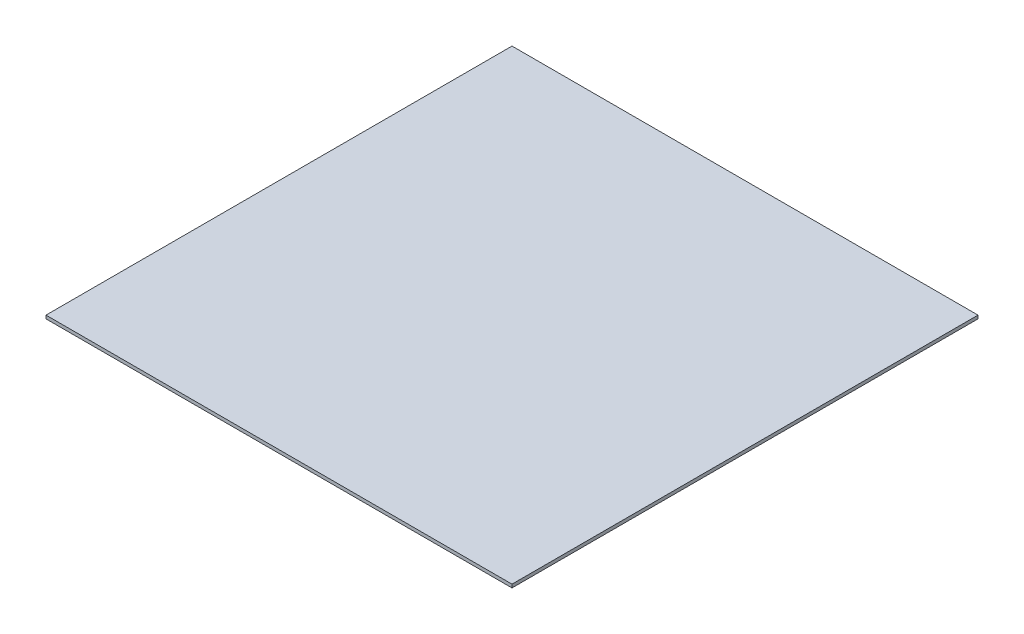
ISO-10303-21;
HEADER;
FILE_DESCRIPTION(('STEP AP214'),'2;1');
FILE_NAME('part.step','',(''),(''),'','','');
FILE_SCHEMA(('AUTOMOTIVE_DESIGN { 1 0 10303 214 1 1 1 1 }'));
ENDSEC;
DATA;
#1=APPLICATION_CONTEXT('core data for automotive mechanical design processes');
#2=APPLICATION_PROTOCOL_DEFINITION('international standard','automotive_design',2000,#1);
#3=PRODUCT_CONTEXT('',#1,'mechanical');
#4=PRODUCT('Part','Part','',(#3));
#5=PRODUCT_RELATED_PRODUCT_CATEGORY('part','',(#4));
#6=PRODUCT_DEFINITION_FORMATION('','',#4);
#7=PRODUCT_DEFINITION_CONTEXT('part definition',#1,'design');
#8=PRODUCT_DEFINITION('design','',#6,#7);
#9=PRODUCT_DEFINITION_SHAPE('','',#8);
#10=(LENGTH_UNIT() NAMED_UNIT(*) SI_UNIT(.MILLI.,.METRE.));
#11=(NAMED_UNIT(*) PLANE_ANGLE_UNIT() SI_UNIT($,.RADIAN.));
#12=(NAMED_UNIT(*) SI_UNIT($,.STERADIAN.) SOLID_ANGLE_UNIT());
#13=UNCERTAINTY_MEASURE_WITH_UNIT(LENGTH_MEASURE(1.E-05),#10,'distance_accuracy_value','');
#14=(GEOMETRIC_REPRESENTATION_CONTEXT(3) GLOBAL_UNCERTAINTY_ASSIGNED_CONTEXT((#13)) GLOBAL_UNIT_ASSIGNED_CONTEXT((#10,
#11,#12)) REPRESENTATION_CONTEXT('',''));
#15=CARTESIAN_POINT('',(0.,0.,0.));
#16=DIRECTION('',(0.,0.,1.));
#17=DIRECTION('',(1.,0.,0.));
#18=AXIS2_PLACEMENT_3D('',#15,#16,#17);
#19=CARTESIAN_POINT('',(0.,3.175,0.));
#20=DIRECTION('',(1.,0.,0.));
#21=DIRECTION('',(0.,0.,-1.));
#22=AXIS2_PLACEMENT_3D('',#19,#20,#21);
#23=PLANE('',#22);
#24=DIRECTION('',(0.,0.,1.));
#25=VECTOR('',#24,1.);
#26=CARTESIAN_POINT('',(0.,0.,0.));
#27=LINE('',#26,#25);
#28=CARTESIAN_POINT('',(0.,0.,-450.));
#29=VERTEX_POINT('',#28);
#30=CARTESIAN_POINT('',(0.,0.,0.));
#31=VERTEX_POINT('',#30);
#32=EDGE_CURVE('E111',#29,#31,#27,.T.);
#33=ORIENTED_EDGE('',*,*,#32,.T.);
#34=DIRECTION('',(0.,-1.,0.));
#35=VECTOR('',#34,1.);
#36=CARTESIAN_POINT('',(0.,3.175,0.));
#37=LINE('',#36,#35);
#38=CARTESIAN_POINT('',(0.,3.175,0.));
#39=VERTEX_POINT('',#38);
#40=EDGE_CURVE('E11',#39,#31,#37,.T.);
#41=ORIENTED_EDGE('',*,*,#40,.F.);
#42=DIRECTION('',(0.,0.,1.));
#43=VECTOR('',#42,1.);
#44=CARTESIAN_POINT('',(0.,3.175,0.));
#45=LINE('',#44,#43);
#46=CARTESIAN_POINT('',(0.,3.175,-450.));
#47=VERTEX_POINT('',#46);
#48=EDGE_CURVE('E95',#47,#39,#45,.T.);
#49=ORIENTED_EDGE('',*,*,#48,.F.);
#50=DIRECTION('',(0.,-1.,0.));
#51=VECTOR('',#50,1.);
#52=CARTESIAN_POINT('',(0.,3.175,-450.));
#53=LINE('',#52,#51);
#54=EDGE_CURVE('E107',#47,#29,#53,.T.);
#55=ORIENTED_EDGE('',*,*,#54,.T.);
#56=EDGE_LOOP('',(#33,#41,#49,#55));
#57=FACE_BOUND('',#56,.T.);
#58=ADVANCED_FACE('F43',(#57),#23,.F.);
#59=CARTESIAN_POINT('',(0.,3.175,0.));
#60=DIRECTION('',(0.,0.,-1.));
#61=DIRECTION('',(-1.,0.,0.));
#62=AXIS2_PLACEMENT_3D('',#59,#60,#61);
#63=PLANE('',#62);
#64=DIRECTION('',(1.,0.,0.));
#65=VECTOR('',#64,1.);
#66=CARTESIAN_POINT('',(0.,0.,0.));
#67=LINE('',#66,#65);
#68=CARTESIAN_POINT('',(450.,0.,0.));
#69=VERTEX_POINT('',#68);
#70=EDGE_CURVE('E100',#31,#69,#67,.T.);
#71=ORIENTED_EDGE('',*,*,#70,.T.);
#72=DIRECTION('',(0.,-1.,0.));
#73=VECTOR('',#72,1.);
#74=CARTESIAN_POINT('',(450.,3.175,0.));
#75=LINE('',#74,#73);
#76=CARTESIAN_POINT('',(450.,3.175,0.));
#77=VERTEX_POINT('',#76);
#78=EDGE_CURVE('E52',#77,#69,#75,.T.);
#79=ORIENTED_EDGE('',*,*,#78,.F.);
#80=DIRECTION('',(1.,0.,0.));
#81=VECTOR('',#80,1.);
#82=CARTESIAN_POINT('',(0.,3.175,0.));
#83=LINE('',#82,#81);
#84=EDGE_CURVE('E90',#39,#77,#83,.T.);
#85=ORIENTED_EDGE('',*,*,#84,.F.);
#86=ORIENTED_EDGE('',*,*,#40,.T.);
#87=EDGE_LOOP('',(#71,#79,#85,#86));
#88=FACE_BOUND('',#87,.T.);
#89=ADVANCED_FACE('F99',(#88),#63,.F.);
#90=CARTESIAN_POINT('',(450.,3.175,0.));
#91=DIRECTION('',(-1.,0.,0.));
#92=DIRECTION('',(0.,0.,1.));
#93=AXIS2_PLACEMENT_3D('',#90,#91,#92);
#94=PLANE('',#93);
#95=DIRECTION('',(0.,0.,-1.));
#96=VECTOR('',#95,1.);
#97=CARTESIAN_POINT('',(450.,0.,0.));
#98=LINE('',#97,#96);
#99=CARTESIAN_POINT('',(450.,0.,-450.));
#100=VERTEX_POINT('',#99);
#101=EDGE_CURVE('E77',#69,#100,#98,.T.);
#102=ORIENTED_EDGE('',*,*,#101,.T.);
#103=DIRECTION('',(0.,-1.,0.));
#104=VECTOR('',#103,1.);
#105=CARTESIAN_POINT('',(450.,3.175,-450.));
#106=LINE('',#105,#104);
#107=CARTESIAN_POINT('',(450.,3.175,-450.));
#108=VERTEX_POINT('',#107);
#109=EDGE_CURVE('E102',#108,#100,#106,.T.);
#110=ORIENTED_EDGE('',*,*,#109,.F.);
#111=DIRECTION('',(0.,0.,-1.));
#112=VECTOR('',#111,1.);
#113=CARTESIAN_POINT('',(450.,3.175,0.));
#114=LINE('',#113,#112);
#115=EDGE_CURVE('E93',#77,#108,#114,.T.);
#116=ORIENTED_EDGE('',*,*,#115,.F.);
#117=ORIENTED_EDGE('',*,*,#78,.T.);
#118=EDGE_LOOP('',(#102,#110,#116,#117));
#119=FACE_BOUND('',#118,.T.);
#120=ADVANCED_FACE('F103',(#119),#94,.F.);
#121=CARTESIAN_POINT('',(0.,3.175,-450.));
#122=DIRECTION('',(0.,0.,1.));
#123=DIRECTION('',(1.,0.,0.));
#124=AXIS2_PLACEMENT_3D('',#121,#122,#123);
#125=PLANE('',#124);
#126=DIRECTION('',(-1.,0.,0.));
#127=VECTOR('',#126,1.);
#128=CARTESIAN_POINT('',(0.,0.,-450.));
#129=LINE('',#128,#127);
#130=EDGE_CURVE('E83',#100,#29,#129,.T.);
#131=ORIENTED_EDGE('',*,*,#130,.T.);
#132=ORIENTED_EDGE('',*,*,#54,.F.);
#133=DIRECTION('',(-1.,0.,0.));
#134=VECTOR('',#133,1.);
#135=CARTESIAN_POINT('',(0.,3.175,-450.));
#136=LINE('',#135,#134);
#137=EDGE_CURVE('E60',#108,#47,#136,.T.);
#138=ORIENTED_EDGE('',*,*,#137,.F.);
#139=ORIENTED_EDGE('',*,*,#109,.T.);
#140=EDGE_LOOP('',(#131,#132,#138,#139));
#141=FACE_BOUND('',#140,.T.);
#142=ADVANCED_FACE('F124',(#141),#125,.F.);
#143=CARTESIAN_POINT('',(0.,3.175,0.));
#144=DIRECTION('',(0.,-1.,0.));
#145=DIRECTION('',(0.,0.,-1.));
#146=AXIS2_PLACEMENT_3D('',#143,#144,#145);
#147=PLANE('',#146);
#148=ORIENTED_EDGE('',*,*,#48,.T.);
#149=ORIENTED_EDGE('',*,*,#84,.T.);
#150=ORIENTED_EDGE('',*,*,#115,.T.);
#151=ORIENTED_EDGE('',*,*,#137,.T.);
#152=EDGE_LOOP('',(#148,#149,#150,#151));
#153=FACE_BOUND('',#152,.T.);
#154=ADVANCED_FACE('F91',(#153),#147,.F.);
#155=CARTESIAN_POINT('',(0.,0.,0.));
#156=DIRECTION('',(0.,-1.,0.));
#157=DIRECTION('',(0.,0.,-1.));
#158=AXIS2_PLACEMENT_3D('',#155,#156,#157);
#159=PLANE('',#158);
#160=ORIENTED_EDGE('',*,*,#32,.F.);
#161=ORIENTED_EDGE('',*,*,#130,.F.);
#162=ORIENTED_EDGE('',*,*,#101,.F.);
#163=ORIENTED_EDGE('',*,*,#70,.F.);
#164=EDGE_LOOP('',(#160,#161,#162,#163));
#165=FACE_BOUND('',#164,.T.);
#166=ADVANCED_FACE('F127',(#165),#159,.T.);
#167=CLOSED_SHELL('',(#58,#89,#120,#142,#154,#166));
#168=MANIFOLD_SOLID_BREP('B2',#167);
#169=ADVANCED_BREP_SHAPE_REPRESENTATION('',(#18,#168),#14);
#170=SHAPE_DEFINITION_REPRESENTATION(#9,#169);
ENDSEC;
END-ISO-10303-21;
